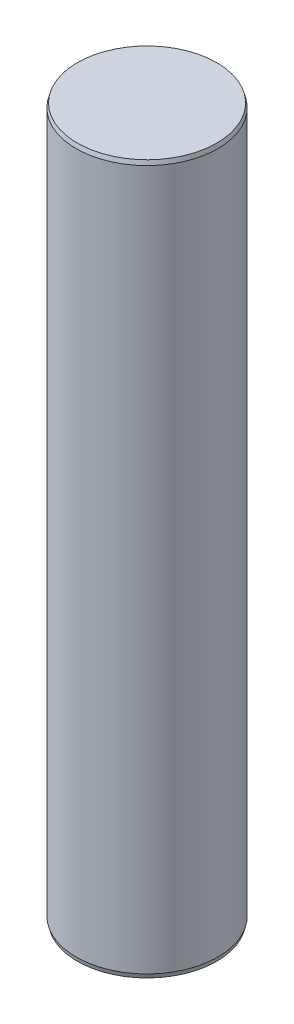
ISO-10303-21;
HEADER;
FILE_DESCRIPTION(('STEP AP214'),'2;1');
FILE_NAME('part.step','',(''),(''),'','','');
FILE_SCHEMA(('AUTOMOTIVE_DESIGN { 1 0 10303 214 1 1 1 1 }'));
ENDSEC;
DATA;
#1=APPLICATION_CONTEXT('core data for automotive mechanical design processes');
#2=APPLICATION_PROTOCOL_DEFINITION('international standard','automotive_design',2000,#1);
#3=PRODUCT_CONTEXT('',#1,'mechanical');
#4=PRODUCT('Part','Part','',(#3));
#5=PRODUCT_RELATED_PRODUCT_CATEGORY('part','',(#4));
#6=PRODUCT_DEFINITION_FORMATION('','',#4);
#7=PRODUCT_DEFINITION_CONTEXT('part definition',#1,'design');
#8=PRODUCT_DEFINITION('design','',#6,#7);
#9=PRODUCT_DEFINITION_SHAPE('','',#8);
#10=(LENGTH_UNIT() NAMED_UNIT(*) SI_UNIT(.MILLI.,.METRE.));
#11=(NAMED_UNIT(*) PLANE_ANGLE_UNIT() SI_UNIT($,.RADIAN.));
#12=(NAMED_UNIT(*) SI_UNIT($,.STERADIAN.) SOLID_ANGLE_UNIT());
#13=UNCERTAINTY_MEASURE_WITH_UNIT(LENGTH_MEASURE(1.E-05),#10,'distance_accuracy_value','');
#14=(GEOMETRIC_REPRESENTATION_CONTEXT(3) GLOBAL_UNCERTAINTY_ASSIGNED_CONTEXT((#13)) GLOBAL_UNIT_ASSIGNED_CONTEXT((#10,
#11,#12)) REPRESENTATION_CONTEXT('',''));
#15=CARTESIAN_POINT('',(0.,0.,0.));
#16=DIRECTION('',(0.,0.,1.));
#17=DIRECTION('',(1.,0.,0.));
#18=AXIS2_PLACEMENT_3D('',#15,#16,#17);
#19=CARTESIAN_POINT('',(0.,-20.,0.));
#20=DIRECTION('',(0.,1.,0.));
#21=DIRECTION('',(0.,0.,1.));
#22=AXIS2_PLACEMENT_3D('',#19,#20,#21);
#23=CONICAL_SURFACE('',#22,1.96784609690827,0.261799387799141);
#24=CARTESIAN_POINT('',(0.,-19.88,0.));
#25=DIRECTION('',(0.,-1.,0.));
#26=DIRECTION('',(0.,0.,-1.));
#27=AXIS2_PLACEMENT_3D('',#24,#25,#26);
#28=CIRCLE('',#27,2.);
#29=CARTESIAN_POINT('',(0.,-19.88,-2.));
#30=VERTEX_POINT('',#29);
#31=EDGE_CURVE('E10',#30,#30,#28,.T.);
#32=ORIENTED_EDGE('',*,*,#31,.T.);
#33=EDGE_LOOP('',(#32));
#34=FACE_BOUND('',#33,.T.);
#35=CARTESIAN_POINT('',(0.,-20.,0.));
#36=DIRECTION('',(0.,-1.,0.));
#37=DIRECTION('',(0.,0.,-1.));
#38=AXIS2_PLACEMENT_3D('',#35,#36,#37);
#39=CIRCLE('',#38,1.96784609690827);
#40=CARTESIAN_POINT('',(0.,-20.,-1.96784609690827));
#41=VERTEX_POINT('',#40);
#42=EDGE_CURVE('E42',#41,#41,#39,.T.);
#43=ORIENTED_EDGE('',*,*,#42,.F.);
#44=EDGE_LOOP('',(#43));
#45=FACE_BOUND('',#44,.T.);
#46=ADVANCED_FACE('F28',(#34,#45),#23,.T.);
#47=CARTESIAN_POINT('',(0.,0.,0.));
#48=DIRECTION('',(0.,-1.,0.));
#49=DIRECTION('',(0.,0.,-1.));
#50=AXIS2_PLACEMENT_3D('',#47,#48,#49);
#51=CYLINDRICAL_SURFACE('',#50,2.);
#52=CARTESIAN_POINT('',(0.,-0.120000000000002,0.));
#53=DIRECTION('',(0.,-1.,0.));
#54=DIRECTION('',(0.,0.,-1.));
#55=AXIS2_PLACEMENT_3D('',#52,#53,#54);
#56=CIRCLE('',#55,2.00000000000001);
#57=CARTESIAN_POINT('',(0.,-0.120000000000002,-2.00000000000001));
#58=VERTEX_POINT('',#57);
#59=EDGE_CURVE('E34',#58,#58,#56,.T.);
#60=ORIENTED_EDGE('',*,*,#59,.T.);
#61=EDGE_LOOP('',(#60));
#62=FACE_BOUND('',#61,.T.);
#63=ORIENTED_EDGE('',*,*,#31,.F.);
#64=EDGE_LOOP('',(#63));
#65=FACE_BOUND('',#64,.T.);
#66=ADVANCED_FACE('F51',(#62,#65),#51,.T.);
#67=CARTESIAN_POINT('',(0.,-0.120000000000002,0.));
#68=DIRECTION('',(0.,-1.,0.));
#69=DIRECTION('',(0.,0.,-1.));
#70=AXIS2_PLACEMENT_3D('',#67,#68,#69);
#71=CONICAL_SURFACE('',#70,2.00000000000001,0.261799387799149);
#72=CARTESIAN_POINT('',(0.,0.,0.));
#73=DIRECTION('',(0.,-1.,0.));
#74=DIRECTION('',(0.,0.,-1.));
#75=AXIS2_PLACEMENT_3D('',#72,#73,#74);
#76=CIRCLE('',#75,1.96784609690827);
#77=CARTESIAN_POINT('',(0.,0.,-1.96784609690827));
#78=VERTEX_POINT('',#77);
#79=EDGE_CURVE('E38',#78,#78,#76,.T.);
#80=ORIENTED_EDGE('',*,*,#79,.T.);
#81=EDGE_LOOP('',(#80));
#82=FACE_BOUND('',#81,.T.);
#83=ORIENTED_EDGE('',*,*,#59,.F.);
#84=EDGE_LOOP('',(#83));
#85=FACE_BOUND('',#84,.T.);
#86=ADVANCED_FACE('F55',(#82,#85),#71,.T.);
#87=CARTESIAN_POINT('',(0.,0.,0.));
#88=DIRECTION('',(0.,1.,0.));
#89=DIRECTION('',(0.,0.,1.));
#90=AXIS2_PLACEMENT_3D('',#87,#88,#89);
#91=PLANE('',#90);
#92=ORIENTED_EDGE('',*,*,#79,.F.);
#93=EDGE_LOOP('',(#92));
#94=FACE_BOUND('',#93,.T.);
#95=ADVANCED_FACE('F59',(#94),#91,.T.);
#96=CARTESIAN_POINT('',(0.,-20.,0.));
#97=DIRECTION('',(0.,-1.,0.));
#98=DIRECTION('',(0.,0.,-1.));
#99=AXIS2_PLACEMENT_3D('',#96,#97,#98);
#100=PLANE('',#99);
#101=ORIENTED_EDGE('',*,*,#42,.T.);
#102=EDGE_LOOP('',(#101));
#103=FACE_BOUND('',#102,.T.);
#104=ADVANCED_FACE('F48',(#103),#100,.T.);
#105=CLOSED_SHELL('',(#46,#66,#86,#95,#104));
#106=MANIFOLD_SOLID_BREP('B2',#105);
#107=ADVANCED_BREP_SHAPE_REPRESENTATION('',(#18,#106),#14);
#108=SHAPE_DEFINITION_REPRESENTATION(#9,#107);
ENDSEC;
END-ISO-10303-21;
